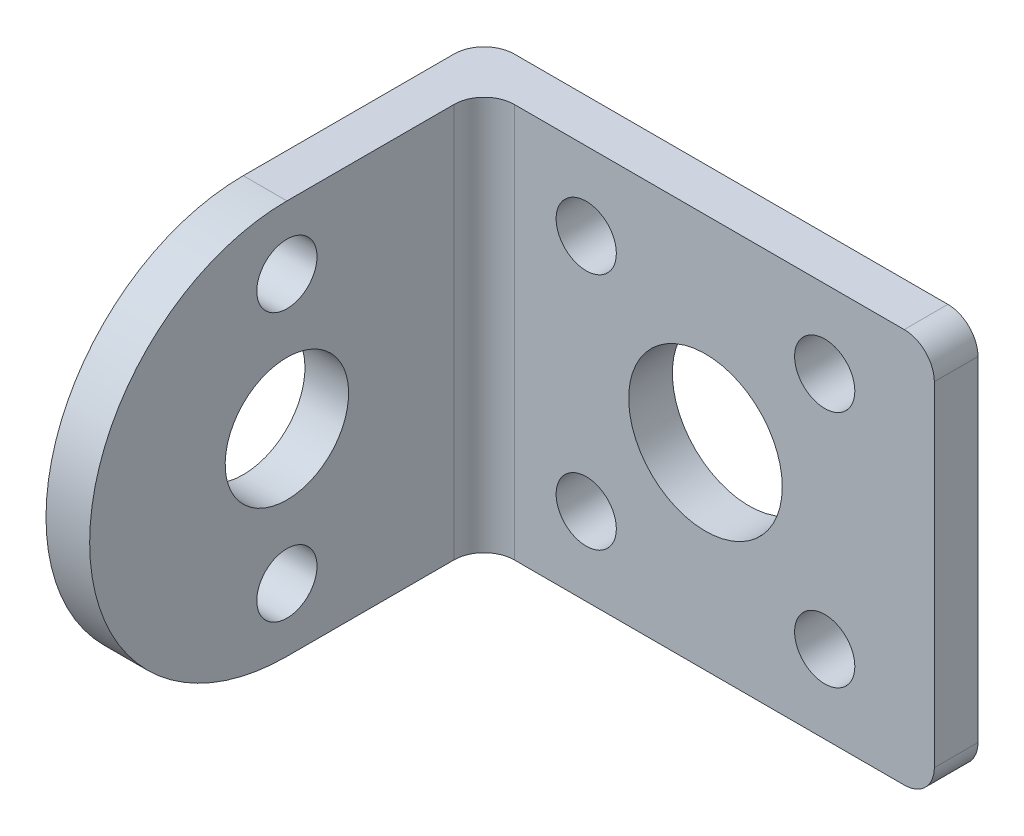
ISO-10303-21;
HEADER;
FILE_DESCRIPTION(('STEP AP214'),'2;1');
FILE_NAME('part.step','',(''),(''),'','','');
FILE_SCHEMA(('AUTOMOTIVE_DESIGN { 1 0 10303 214 1 1 1 1 }'));
ENDSEC;
DATA;
#1=APPLICATION_CONTEXT('core data for automotive mechanical design processes');
#2=APPLICATION_PROTOCOL_DEFINITION('international standard','automotive_design',2000,#1);
#3=PRODUCT_CONTEXT('',#1,'mechanical');
#4=PRODUCT('Part','Part','',(#3));
#5=PRODUCT_RELATED_PRODUCT_CATEGORY('part','',(#4));
#6=PRODUCT_DEFINITION_FORMATION('','',#4);
#7=PRODUCT_DEFINITION_CONTEXT('part definition',#1,'design');
#8=PRODUCT_DEFINITION('design','',#6,#7);
#9=PRODUCT_DEFINITION_SHAPE('','',#8);
#10=(LENGTH_UNIT() NAMED_UNIT(*) SI_UNIT(.MILLI.,.METRE.));
#11=(NAMED_UNIT(*) PLANE_ANGLE_UNIT() SI_UNIT($,.RADIAN.));
#12=(NAMED_UNIT(*) SI_UNIT($,.STERADIAN.) SOLID_ANGLE_UNIT());
#13=UNCERTAINTY_MEASURE_WITH_UNIT(LENGTH_MEASURE(1.E-05),#10,'distance_accuracy_value','');
#14=(GEOMETRIC_REPRESENTATION_CONTEXT(3) GLOBAL_UNCERTAINTY_ASSIGNED_CONTEXT((#13)) GLOBAL_UNIT_ASSIGNED_CONTEXT((#10,
#11,#12)) REPRESENTATION_CONTEXT('',''));
#15=CARTESIAN_POINT('',(0.,0.,0.));
#16=DIRECTION('',(0.,0.,1.));
#17=DIRECTION('',(1.,0.,0.));
#18=AXIS2_PLACEMENT_3D('',#15,#16,#17);
#19=CARTESIAN_POINT('',(0.,0.,1.45));
#20=DIRECTION('',(1.,0.,0.));
#21=DIRECTION('',(0.,1.,0.));
#22=AXIS2_PLACEMENT_3D('',#19,#20,#21);
#23=PLANE('',#22);
#24=CARTESIAN_POINT('',(0.,-8.9,16.));
#25=DIRECTION('',(-1.,0.,0.));
#26=DIRECTION('',(0.,1.,0.));
#27=AXIS2_PLACEMENT_3D('',#24,#25,#26);
#28=CIRCLE('',#27,2.);
#29=CARTESIAN_POINT('',(0.,-10.9,16.));
#30=VERTEX_POINT('',#29);
#31=EDGE_CURVE('E348',#30,#30,#28,.T.);
#32=ORIENTED_EDGE('',*,*,#31,.F.);
#33=EDGE_LOOP('',(#32));
#34=FACE_BOUND('',#33,.T.);
#35=CARTESIAN_POINT('',(0.,8.9,16.));
#36=DIRECTION('',(-1.,0.,0.));
#37=DIRECTION('',(0.,1.,0.));
#38=AXIS2_PLACEMENT_3D('',#35,#36,#37);
#39=CIRCLE('',#38,2.);
#40=CARTESIAN_POINT('',(0.,6.9,16.));
#41=VERTEX_POINT('',#40);
#42=EDGE_CURVE('E260',#41,#41,#39,.T.);
#43=ORIENTED_EDGE('',*,*,#42,.F.);
#44=EDGE_LOOP('',(#43));
#45=FACE_BOUND('',#44,.T.);
#46=CARTESIAN_POINT('',(0.,0.,16.));
#47=DIRECTION('',(-1.,0.,0.));
#48=DIRECTION('',(0.,1.,0.));
#49=AXIS2_PLACEMENT_3D('',#46,#47,#48);
#50=CIRCLE('',#49,4.1);
#51=CARTESIAN_POINT('',(0.,-4.1,16.));
#52=VERTEX_POINT('',#51);
#53=EDGE_CURVE('E201',#52,#52,#50,.T.);
#54=ORIENTED_EDGE('',*,*,#53,.F.);
#55=EDGE_LOOP('',(#54));
#56=FACE_BOUND('',#55,.T.);
#57=DIRECTION('',(0.,1.,0.));
#58=VECTOR('',#57,1.);
#59=CARTESIAN_POINT('',(0.,-6.55,2.));
#60=LINE('',#59,#58);
#61=CARTESIAN_POINT('',(0.,-13.1,2.));
#62=VERTEX_POINT('',#61);
#63=CARTESIAN_POINT('',(0.,13.1,2.));
#64=VERTEX_POINT('',#63);
#65=EDGE_CURVE('E297',#62,#64,#60,.T.);
#66=ORIENTED_EDGE('',*,*,#65,.F.);
#67=DIRECTION('',(0.,0.,1.));
#68=VECTOR('',#67,1.);
#69=CARTESIAN_POINT('',(0.,-13.1,2.9));
#70=LINE('',#69,#68);
#71=CARTESIAN_POINT('',(0.,-13.1,16.));
#72=VERTEX_POINT('',#71);
#73=EDGE_CURVE('E11',#62,#72,#70,.T.);
#74=ORIENTED_EDGE('',*,*,#73,.T.);
#75=CARTESIAN_POINT('',(0.,0.,16.));
#76=DIRECTION('',(1.,0.,0.));
#77=DIRECTION('',(0.,1.,0.));
#78=AXIS2_PLACEMENT_3D('',#75,#76,#77);
#79=CIRCLE('',#78,13.1);
#80=CARTESIAN_POINT('',(0.,13.1,16.));
#81=VERTEX_POINT('',#80);
#82=EDGE_CURVE('E218',#81,#72,#79,.T.);
#83=ORIENTED_EDGE('',*,*,#82,.F.);
#84=DIRECTION('',(0.,0.,-1.));
#85=VECTOR('',#84,1.);
#86=CARTESIAN_POINT('',(0.,13.1,2.9));
#87=LINE('',#86,#85);
#88=EDGE_CURVE('E296',#81,#64,#87,.T.);
#89=ORIENTED_EDGE('',*,*,#88,.T.);
#90=EDGE_LOOP('',(#66,#74,#83,#89));
#91=FACE_BOUND('',#90,.T.);
#92=ADVANCED_FACE('F16',(#34,#45,#56,#91),#23,.F.);
#93=CARTESIAN_POINT('',(0.,13.1,2.9));
#94=DIRECTION('',(0.,0.,1.));
#95=DIRECTION('',(1.,0.,0.));
#96=AXIS2_PLACEMENT_3D('',#93,#94,#95);
#97=PLANE('',#96);
#98=CARTESIAN_POINT('',(9.68040405071067,7.91959594928933,2.9));
#99=DIRECTION('',(0.,0.,-1.));
#100=DIRECTION('',(-1.,0.,0.));
#101=AXIS2_PLACEMENT_3D('',#98,#99,#100);
#102=CIRCLE('',#101,2.);
#103=CARTESIAN_POINT('',(11.6804040507107,7.91959594928933,2.9));
#104=VERTEX_POINT('',#103);
#105=EDGE_CURVE('E199',#104,#104,#102,.T.);
#106=ORIENTED_EDGE('',*,*,#105,.T.);
#107=EDGE_LOOP('',(#106));
#108=FACE_BOUND('',#107,.T.);
#109=CARTESIAN_POINT('',(17.6,0.,2.9));
#110=DIRECTION('',(0.,0.,-1.));
#111=DIRECTION('',(-1.,0.,0.));
#112=AXIS2_PLACEMENT_3D('',#109,#110,#111);
#113=CIRCLE('',#112,5.1);
#114=CARTESIAN_POINT('',(22.7,0.,2.9));
#115=VERTEX_POINT('',#114);
#116=EDGE_CURVE('E195',#115,#115,#113,.T.);
#117=ORIENTED_EDGE('',*,*,#116,.T.);
#118=EDGE_LOOP('',(#117));
#119=FACE_BOUND('',#118,.T.);
#120=CARTESIAN_POINT('',(25.5195959492893,-7.91959594928934,2.9));
#121=DIRECTION('',(0.,0.,-1.));
#122=DIRECTION('',(-1.,0.,0.));
#123=AXIS2_PLACEMENT_3D('',#120,#121,#122);
#124=CIRCLE('',#123,2.);
#125=CARTESIAN_POINT('',(27.5195959492893,-7.91959594928934,2.9));
#126=VERTEX_POINT('',#125);
#127=EDGE_CURVE('E179',#126,#126,#124,.T.);
#128=ORIENTED_EDGE('',*,*,#127,.T.);
#129=EDGE_LOOP('',(#128));
#130=FACE_BOUND('',#129,.T.);
#131=CARTESIAN_POINT('',(9.68040405071067,-7.91959594928934,2.9));
#132=DIRECTION('',(0.,0.,-1.));
#133=DIRECTION('',(-1.,0.,0.));
#134=AXIS2_PLACEMENT_3D('',#131,#132,#133);
#135=CIRCLE('',#134,2.);
#136=CARTESIAN_POINT('',(11.6804040507107,-7.91959594928934,2.9));
#137=VERTEX_POINT('',#136);
#138=EDGE_CURVE('E183',#137,#137,#135,.T.);
#139=ORIENTED_EDGE('',*,*,#138,.T.);
#140=EDGE_LOOP('',(#139));
#141=FACE_BOUND('',#140,.T.);
#142=CARTESIAN_POINT('',(25.5195959492893,7.91959594928933,2.9));
#143=DIRECTION('',(0.,0.,-1.));
#144=DIRECTION('',(-1.,0.,0.));
#145=AXIS2_PLACEMENT_3D('',#142,#143,#144);
#146=CIRCLE('',#145,2.);
#147=CARTESIAN_POINT('',(27.5195959492893,7.91959594928933,2.9));
#148=VERTEX_POINT('',#147);
#149=EDGE_CURVE('E322',#148,#148,#146,.T.);
#150=ORIENTED_EDGE('',*,*,#149,.T.);
#151=EDGE_LOOP('',(#150));
#152=FACE_BOUND('',#151,.T.);
#153=CARTESIAN_POINT('',(30.8,11.1,2.9));
#154=DIRECTION('',(0.,0.,-1.));
#155=DIRECTION('',(0.707106781186548,0.707106781186547,0.));
#156=AXIS2_PLACEMENT_3D('',#153,#154,#155);
#157=CIRCLE('',#156,2.);
#158=CARTESIAN_POINT('',(30.8,13.1,2.9));
#159=VERTEX_POINT('',#158);
#160=CARTESIAN_POINT('',(32.8,11.1,2.9));
#161=VERTEX_POINT('',#160);
#162=EDGE_CURVE('E289',#159,#161,#157,.T.);
#163=ORIENTED_EDGE('',*,*,#162,.F.);
#164=DIRECTION('',(1.,0.,0.));
#165=VECTOR('',#164,1.);
#166=CARTESIAN_POINT('',(0.,13.1,2.9));
#167=LINE('',#166,#165);
#168=CARTESIAN_POINT('',(4.9,13.1,2.9));
#169=VERTEX_POINT('',#168);
#170=EDGE_CURVE('E223',#169,#159,#167,.T.);
#171=ORIENTED_EDGE('',*,*,#170,.F.);
#172=DIRECTION('',(0.,1.,0.));
#173=VECTOR('',#172,1.);
#174=CARTESIAN_POINT('',(4.9,6.55,2.9));
#175=LINE('',#174,#173);
#176=CARTESIAN_POINT('',(4.9,-13.1,2.9));
#177=VERTEX_POINT('',#176);
#178=EDGE_CURVE('E234',#177,#169,#175,.T.);
#179=ORIENTED_EDGE('',*,*,#178,.F.);
#180=DIRECTION('',(1.,0.,0.));
#181=VECTOR('',#180,1.);
#182=CARTESIAN_POINT('',(0.,-13.1,2.9));
#183=LINE('',#182,#181);
#184=CARTESIAN_POINT('',(30.8,-13.1,2.9));
#185=VERTEX_POINT('',#184);
#186=EDGE_CURVE('E27',#177,#185,#183,.T.);
#187=ORIENTED_EDGE('',*,*,#186,.T.);
#188=CARTESIAN_POINT('',(30.8,-11.1,2.9));
#189=DIRECTION('',(0.,0.,-1.));
#190=DIRECTION('',(0.707106781186548,-0.707106781186547,0.));
#191=AXIS2_PLACEMENT_3D('',#188,#189,#190);
#192=CIRCLE('',#191,2.);
#193=CARTESIAN_POINT('',(32.8,-11.1,2.9));
#194=VERTEX_POINT('',#193);
#195=EDGE_CURVE('E210',#194,#185,#192,.T.);
#196=ORIENTED_EDGE('',*,*,#195,.F.);
#197=DIRECTION('',(0.,-1.,0.));
#198=VECTOR('',#197,1.);
#199=CARTESIAN_POINT('',(32.8,-13.1,2.9));
#200=LINE('',#199,#198);
#201=EDGE_CURVE('E253',#161,#194,#200,.T.);
#202=ORIENTED_EDGE('',*,*,#201,.F.);
#203=EDGE_LOOP('',(#163,#171,#179,#187,#196,#202));
#204=FACE_BOUND('',#203,.T.);
#205=ADVANCED_FACE('F186',(#108,#119,#130,#141,#152,#204),#97,.T.);
#206=CARTESIAN_POINT('',(0.,-13.1,2.9));
#207=DIRECTION('',(0.,-1.,0.));
#208=DIRECTION('',(0.,0.,-1.));
#209=AXIS2_PLACEMENT_3D('',#206,#207,#208);
#210=PLANE('',#209);
#211=DIRECTION('',(0.,0.,-1.));
#212=VECTOR('',#211,1.);
#213=CARTESIAN_POINT('',(30.8,-13.1,2.175));
#214=LINE('',#213,#212);
#215=CARTESIAN_POINT('',(30.8,-13.1,0.));
#216=VERTEX_POINT('',#215);
#217=EDGE_CURVE('E206',#185,#216,#214,.T.);
#218=ORIENTED_EDGE('',*,*,#217,.F.);
#219=ORIENTED_EDGE('',*,*,#186,.F.);
#220=CARTESIAN_POINT('',(4.9,-13.1,4.9));
#221=DIRECTION('',(0.,-1.,0.));
#222=DIRECTION('',(-0.707106781186548,0.,-0.707106781186548));
#223=AXIS2_PLACEMENT_3D('',#220,#221,#222);
#224=CIRCLE('',#223,2.);
#225=CARTESIAN_POINT('',(2.9,-13.1,4.9));
#226=VERTEX_POINT('',#225);
#227=EDGE_CURVE('E222',#226,#177,#224,.T.);
#228=ORIENTED_EDGE('',*,*,#227,.F.);
#229=DIRECTION('',(0.,0.,-1.));
#230=VECTOR('',#229,1.);
#231=CARTESIAN_POINT('',(2.9,-13.1,2.9));
#232=LINE('',#231,#230);
#233=CARTESIAN_POINT('',(2.9,-13.1,16.));
#234=VERTEX_POINT('',#233);
#235=EDGE_CURVE('E314',#234,#226,#232,.T.);
#236=ORIENTED_EDGE('',*,*,#235,.F.);
#237=DIRECTION('',(1.,0.,0.));
#238=VECTOR('',#237,1.);
#239=CARTESIAN_POINT('',(0.,-13.1,16.));
#240=LINE('',#239,#238);
#241=EDGE_CURVE('E215',#72,#234,#240,.T.);
#242=ORIENTED_EDGE('',*,*,#241,.F.);
#243=ORIENTED_EDGE('',*,*,#73,.F.);
#244=CARTESIAN_POINT('',(2.,-13.1,2.));
#245=DIRECTION('',(0.,1.,0.));
#246=DIRECTION('',(-0.707106781186548,0.,-0.707106781186548));
#247=AXIS2_PLACEMENT_3D('',#244,#245,#246);
#248=CIRCLE('',#247,2.);
#249=CARTESIAN_POINT('',(2.,-13.1,0.));
#250=VERTEX_POINT('',#249);
#251=EDGE_CURVE('E209',#250,#62,#248,.T.);
#252=ORIENTED_EDGE('',*,*,#251,.F.);
#253=DIRECTION('',(1.,0.,0.));
#254=VECTOR('',#253,1.);
#255=CARTESIAN_POINT('',(0.,-13.1,0.));
#256=LINE('',#255,#254);
#257=EDGE_CURVE('E241',#250,#216,#256,.T.);
#258=ORIENTED_EDGE('',*,*,#257,.T.);
#259=EDGE_LOOP('',(#218,#219,#228,#236,#242,#243,#252,#258));
#260=FACE_BOUND('',#259,.T.);
#261=ADVANCED_FACE('F239',(#260),#210,.T.);
#262=CARTESIAN_POINT('',(0.,0.,16.));
#263=DIRECTION('',(1.,0.,0.));
#264=DIRECTION('',(0.,1.,0.));
#265=AXIS2_PLACEMENT_3D('',#262,#263,#264);
#266=CYLINDRICAL_SURFACE('',#265,13.1);
#267=ORIENTED_EDGE('',*,*,#82,.T.);
#268=ORIENTED_EDGE('',*,*,#241,.T.);
#269=CARTESIAN_POINT('',(2.9,0.,16.));
#270=DIRECTION('',(1.,0.,0.));
#271=DIRECTION('',(0.,1.,0.));
#272=AXIS2_PLACEMENT_3D('',#269,#270,#271);
#273=CIRCLE('',#272,13.1);
#274=CARTESIAN_POINT('',(2.9,13.1,16.));
#275=VERTEX_POINT('',#274);
#276=EDGE_CURVE('E331',#275,#234,#273,.T.);
#277=ORIENTED_EDGE('',*,*,#276,.F.);
#278=DIRECTION('',(1.,0.,0.));
#279=VECTOR('',#278,1.);
#280=CARTESIAN_POINT('',(0.,13.1,16.));
#281=LINE('',#280,#279);
#282=EDGE_CURVE('E288',#81,#275,#281,.T.);
#283=ORIENTED_EDGE('',*,*,#282,.F.);
#284=EDGE_LOOP('',(#267,#268,#277,#283));
#285=FACE_BOUND('',#284,.T.);
#286=ADVANCED_FACE('F671',(#285),#266,.T.);
#287=CARTESIAN_POINT('',(0.,-8.9,16.));
#288=DIRECTION('',(1.,0.,0.));
#289=DIRECTION('',(0.,1.,0.));
#290=AXIS2_PLACEMENT_3D('',#287,#288,#289);
#291=CYLINDRICAL_SURFACE('',#290,2.);
#292=CARTESIAN_POINT('',(2.9,-8.9,16.));
#293=DIRECTION('',(-1.,0.,0.));
#294=DIRECTION('',(0.,1.,0.));
#295=AXIS2_PLACEMENT_3D('',#292,#293,#294);
#296=CIRCLE('',#295,2.);
#297=CARTESIAN_POINT('',(2.9,-10.9,16.));
#298=VERTEX_POINT('',#297);
#299=EDGE_CURVE('E306',#298,#298,#296,.T.);
#300=ORIENTED_EDGE('',*,*,#299,.F.);
#301=DIRECTION('',(-1.,0.,0.));
#302=VECTOR('',#301,1.);
#303=CARTESIAN_POINT('',(0.,-10.9,16.));
#304=LINE('',#303,#302);
#305=EDGE_CURVE('E351',#298,#30,#304,.T.);
#306=ORIENTED_EDGE('',*,*,#305,.T.);
#307=ORIENTED_EDGE('',*,*,#31,.T.);
#308=ORIENTED_EDGE('',*,*,#305,.F.);
#309=EDGE_LOOP('',(#300,#306,#307,#308));
#310=FACE_BOUND('',#309,.T.);
#311=ADVANCED_FACE('F617',(#310),#291,.F.);
#312=CARTESIAN_POINT('',(0.,8.9,16.));
#313=DIRECTION('',(1.,0.,0.));
#314=DIRECTION('',(0.,1.,0.));
#315=AXIS2_PLACEMENT_3D('',#312,#313,#314);
#316=CYLINDRICAL_SURFACE('',#315,2.);
#317=CARTESIAN_POINT('',(2.9,8.9,16.));
#318=DIRECTION('',(-1.,0.,0.));
#319=DIRECTION('',(0.,1.,0.));
#320=AXIS2_PLACEMENT_3D('',#317,#318,#319);
#321=CIRCLE('',#320,2.);
#322=CARTESIAN_POINT('',(2.9,6.9,16.));
#323=VERTEX_POINT('',#322);
#324=EDGE_CURVE('E302',#323,#323,#321,.T.);
#325=ORIENTED_EDGE('',*,*,#324,.F.);
#326=DIRECTION('',(-1.,0.,0.));
#327=VECTOR('',#326,1.);
#328=CARTESIAN_POINT('',(0.,6.9,16.));
#329=LINE('',#328,#327);
#330=EDGE_CURVE('E204',#323,#41,#329,.T.);
#331=ORIENTED_EDGE('',*,*,#330,.T.);
#332=ORIENTED_EDGE('',*,*,#42,.T.);
#333=ORIENTED_EDGE('',*,*,#330,.F.);
#334=EDGE_LOOP('',(#325,#331,#332,#333));
#335=FACE_BOUND('',#334,.T.);
#336=ADVANCED_FACE('F569',(#335),#316,.F.);
#337=CARTESIAN_POINT('',(0.,0.,16.));
#338=DIRECTION('',(1.,0.,0.));
#339=DIRECTION('',(0.,1.,0.));
#340=AXIS2_PLACEMENT_3D('',#337,#338,#339);
#341=CYLINDRICAL_SURFACE('',#340,4.1);
#342=CARTESIAN_POINT('',(2.9,0.,16.));
#343=DIRECTION('',(-1.,0.,0.));
#344=DIRECTION('',(0.,1.,0.));
#345=AXIS2_PLACEMENT_3D('',#342,#343,#344);
#346=CIRCLE('',#345,4.1);
#347=CARTESIAN_POINT('',(2.9,-4.1,16.));
#348=VERTEX_POINT('',#347);
#349=EDGE_CURVE('E307',#348,#348,#346,.T.);
#350=ORIENTED_EDGE('',*,*,#349,.F.);
#351=DIRECTION('',(-1.,0.,0.));
#352=VECTOR('',#351,1.);
#353=CARTESIAN_POINT('',(0.,-4.1,16.));
#354=LINE('',#353,#352);
#355=EDGE_CURVE('E205',#348,#52,#354,.T.);
#356=ORIENTED_EDGE('',*,*,#355,.T.);
#357=ORIENTED_EDGE('',*,*,#53,.T.);
#358=ORIENTED_EDGE('',*,*,#355,.F.);
#359=EDGE_LOOP('',(#350,#356,#357,#358));
#360=FACE_BOUND('',#359,.T.);
#361=ADVANCED_FACE('F564',(#360),#341,.F.);
#362=CARTESIAN_POINT('',(25.5195959492893,7.91959594928933,2.9));
#363=DIRECTION('',(0.,0.,-1.));
#364=DIRECTION('',(-1.,0.,0.));
#365=AXIS2_PLACEMENT_3D('',#362,#363,#364);
#366=CYLINDRICAL_SURFACE('',#365,2.);
#367=ORIENTED_EDGE('',*,*,#149,.F.);
#368=DIRECTION('',(0.,0.,-1.));
#369=VECTOR('',#368,1.);
#370=CARTESIAN_POINT('',(27.5195959492893,7.91959594928933,2.9));
#371=LINE('',#370,#369);
#372=CARTESIAN_POINT('',(27.5195959492893,7.91959594928933,0.));
#373=VERTEX_POINT('',#372);
#374=EDGE_CURVE('E276',#148,#373,#371,.T.);
#375=ORIENTED_EDGE('',*,*,#374,.T.);
#376=CARTESIAN_POINT('',(25.5195959492893,7.91959594928933,0.));
#377=DIRECTION('',(0.,0.,1.));
#378=DIRECTION('',(-1.,0.,0.));
#379=AXIS2_PLACEMENT_3D('',#376,#377,#378);
#380=CIRCLE('',#379,2.);
#381=EDGE_CURVE('E315',#373,#373,#380,.T.);
#382=ORIENTED_EDGE('',*,*,#381,.F.);
#383=ORIENTED_EDGE('',*,*,#374,.F.);
#384=EDGE_LOOP('',(#367,#375,#382,#383));
#385=FACE_BOUND('',#384,.T.);
#386=ADVANCED_FACE('F568',(#385),#366,.F.);
#387=CARTESIAN_POINT('',(9.68040405071067,-7.91959594928934,2.9));
#388=DIRECTION('',(0.,0.,-1.));
#389=DIRECTION('',(-1.,0.,0.));
#390=AXIS2_PLACEMENT_3D('',#387,#388,#389);
#391=CYLINDRICAL_SURFACE('',#390,2.);
#392=ORIENTED_EDGE('',*,*,#138,.F.);
#393=DIRECTION('',(0.,0.,-1.));
#394=VECTOR('',#393,1.);
#395=CARTESIAN_POINT('',(11.6804040507107,-7.91959594928934,2.9));
#396=LINE('',#395,#394);
#397=CARTESIAN_POINT('',(11.6804040507107,-7.91959594928934,0.));
#398=VERTEX_POINT('',#397);
#399=EDGE_CURVE('E214',#137,#398,#396,.T.);
#400=ORIENTED_EDGE('',*,*,#399,.T.);
#401=CARTESIAN_POINT('',(9.68040405071067,-7.91959594928934,0.));
#402=DIRECTION('',(0.,0.,1.));
#403=DIRECTION('',(-1.,0.,0.));
#404=AXIS2_PLACEMENT_3D('',#401,#402,#403);
#405=CIRCLE('',#404,2.);
#406=EDGE_CURVE('E267',#398,#398,#405,.T.);
#407=ORIENTED_EDGE('',*,*,#406,.F.);
#408=ORIENTED_EDGE('',*,*,#399,.F.);
#409=EDGE_LOOP('',(#392,#400,#407,#408));
#410=FACE_BOUND('',#409,.T.);
#411=ADVANCED_FACE('F600',(#410),#391,.F.);
#412=CARTESIAN_POINT('',(25.5195959492893,-7.91959594928934,2.9));
#413=DIRECTION('',(0.,0.,-1.));
#414=DIRECTION('',(-1.,0.,0.));
#415=AXIS2_PLACEMENT_3D('',#412,#413,#414);
#416=CYLINDRICAL_SURFACE('',#415,2.);
#417=ORIENTED_EDGE('',*,*,#127,.F.);
#418=DIRECTION('',(0.,0.,-1.));
#419=VECTOR('',#418,1.);
#420=CARTESIAN_POINT('',(27.5195959492893,-7.91959594928934,2.9));
#421=LINE('',#420,#419);
#422=CARTESIAN_POINT('',(27.5195959492893,-7.91959594928934,0.));
#423=VERTEX_POINT('',#422);
#424=EDGE_CURVE('E176',#126,#423,#421,.T.);
#425=ORIENTED_EDGE('',*,*,#424,.T.);
#426=CARTESIAN_POINT('',(25.5195959492893,-7.91959594928934,0.));
#427=DIRECTION('',(0.,0.,1.));
#428=DIRECTION('',(-1.,0.,0.));
#429=AXIS2_PLACEMENT_3D('',#426,#427,#428);
#430=CIRCLE('',#429,2.);
#431=EDGE_CURVE('E181',#423,#423,#430,.T.);
#432=ORIENTED_EDGE('',*,*,#431,.F.);
#433=ORIENTED_EDGE('',*,*,#424,.F.);
#434=EDGE_LOOP('',(#417,#425,#432,#433));
#435=FACE_BOUND('',#434,.T.);
#436=ADVANCED_FACE('F178',(#435),#416,.F.);
#437=CARTESIAN_POINT('',(17.6,0.,2.9));
#438=DIRECTION('',(0.,0.,-1.));
#439=DIRECTION('',(-1.,0.,0.));
#440=AXIS2_PLACEMENT_3D('',#437,#438,#439);
#441=CYLINDRICAL_SURFACE('',#440,5.1);
#442=ORIENTED_EDGE('',*,*,#116,.F.);
#443=DIRECTION('',(0.,0.,-1.));
#444=VECTOR('',#443,1.);
#445=CARTESIAN_POINT('',(22.7,0.,2.9));
#446=LINE('',#445,#444);
#447=CARTESIAN_POINT('',(22.7,0.,0.));
#448=VERTEX_POINT('',#447);
#449=EDGE_CURVE('E189',#115,#448,#446,.T.);
#450=ORIENTED_EDGE('',*,*,#449,.T.);
#451=CARTESIAN_POINT('',(17.6,0.,0.));
#452=DIRECTION('',(0.,0.,1.));
#453=DIRECTION('',(-1.,0.,0.));
#454=AXIS2_PLACEMENT_3D('',#451,#452,#453);
#455=CIRCLE('',#454,5.1);
#456=EDGE_CURVE('E268',#448,#448,#455,.T.);
#457=ORIENTED_EDGE('',*,*,#456,.F.);
#458=ORIENTED_EDGE('',*,*,#449,.F.);
#459=EDGE_LOOP('',(#442,#450,#457,#458));
#460=FACE_BOUND('',#459,.T.);
#461=ADVANCED_FACE('F609',(#460),#441,.F.);
#462=CARTESIAN_POINT('',(9.68040405071067,7.91959594928933,2.9));
#463=DIRECTION('',(0.,0.,-1.));
#464=DIRECTION('',(-1.,0.,0.));
#465=AXIS2_PLACEMENT_3D('',#462,#463,#464);
#466=CYLINDRICAL_SURFACE('',#465,2.);
#467=ORIENTED_EDGE('',*,*,#105,.F.);
#468=DIRECTION('',(0.,0.,-1.));
#469=VECTOR('',#468,1.);
#470=CARTESIAN_POINT('',(11.6804040507107,7.91959594928933,2.9));
#471=LINE('',#470,#469);
#472=CARTESIAN_POINT('',(11.6804040507107,7.91959594928933,0.));
#473=VERTEX_POINT('',#472);
#474=EDGE_CURVE('E264',#104,#473,#471,.T.);
#475=ORIENTED_EDGE('',*,*,#474,.T.);
#476=CARTESIAN_POINT('',(9.68040405071067,7.91959594928933,0.));
#477=DIRECTION('',(0.,0.,1.));
#478=DIRECTION('',(-1.,0.,0.));
#479=AXIS2_PLACEMENT_3D('',#476,#477,#478);
#480=CIRCLE('',#479,2.);
#481=EDGE_CURVE('E20',#473,#473,#480,.T.);
#482=ORIENTED_EDGE('',*,*,#481,.F.);
#483=ORIENTED_EDGE('',*,*,#474,.F.);
#484=EDGE_LOOP('',(#467,#475,#482,#483));
#485=FACE_BOUND('',#484,.T.);
#486=ADVANCED_FACE('F424',(#485),#466,.F.);
#487=CARTESIAN_POINT('',(2.9,0.,16.));
#488=DIRECTION('',(1.,0.,0.));
#489=DIRECTION('',(0.,1.,0.));
#490=AXIS2_PLACEMENT_3D('',#487,#488,#489);
#491=PLANE('',#490);
#492=ORIENTED_EDGE('',*,*,#299,.T.);
#493=EDGE_LOOP('',(#492));
#494=FACE_BOUND('',#493,.T.);
#495=ORIENTED_EDGE('',*,*,#324,.T.);
#496=EDGE_LOOP('',(#495));
#497=FACE_BOUND('',#496,.T.);
#498=ORIENTED_EDGE('',*,*,#349,.T.);
#499=EDGE_LOOP('',(#498));
#500=FACE_BOUND('',#499,.T.);
#501=DIRECTION('',(0.,-1.,0.));
#502=VECTOR('',#501,1.);
#503=CARTESIAN_POINT('',(2.9,6.55,4.9));
#504=LINE('',#503,#502);
#505=CARTESIAN_POINT('',(2.9,13.1,4.9));
#506=VERTEX_POINT('',#505);
#507=EDGE_CURVE('E219',#506,#226,#504,.T.);
#508=ORIENTED_EDGE('',*,*,#507,.F.);
#509=DIRECTION('',(0.,0.,1.));
#510=VECTOR('',#509,1.);
#511=CARTESIAN_POINT('',(2.9,13.1,2.9));
#512=LINE('',#511,#510);
#513=EDGE_CURVE('E283',#506,#275,#512,.T.);
#514=ORIENTED_EDGE('',*,*,#513,.T.);
#515=ORIENTED_EDGE('',*,*,#276,.T.);
#516=ORIENTED_EDGE('',*,*,#235,.T.);
#517=EDGE_LOOP('',(#508,#514,#515,#516));
#518=FACE_BOUND('',#517,.T.);
#519=ADVANCED_FACE('F18',(#494,#497,#500,#518),#491,.T.);
#520=CARTESIAN_POINT('',(4.9,6.55,4.9));
#521=DIRECTION('',(0.,-1.,0.));
#522=DIRECTION('',(-0.707106781186548,0.,-0.707106781186548));
#523=AXIS2_PLACEMENT_3D('',#520,#521,#522);
#524=CYLINDRICAL_SURFACE('',#523,2.);
#525=CARTESIAN_POINT('',(4.9,13.1,4.9));
#526=DIRECTION('',(0.,1.,0.));
#527=DIRECTION('',(-0.707106781186548,0.,-0.707106781186548));
#528=AXIS2_PLACEMENT_3D('',#525,#526,#527);
#529=CIRCLE('',#528,2.);
#530=EDGE_CURVE('E287',#169,#506,#529,.T.);
#531=ORIENTED_EDGE('',*,*,#530,.T.);
#532=ORIENTED_EDGE('',*,*,#507,.T.);
#533=ORIENTED_EDGE('',*,*,#227,.T.);
#534=ORIENTED_EDGE('',*,*,#178,.T.);
#535=EDGE_LOOP('',(#531,#532,#533,#534));
#536=FACE_BOUND('',#535,.T.);
#537=ADVANCED_FACE('F393',(#536),#524,.F.);
#538=CARTESIAN_POINT('',(0.,13.1,0.));
#539=DIRECTION('',(0.,1.,0.));
#540=DIRECTION('',(1.,0.,0.));
#541=AXIS2_PLACEMENT_3D('',#538,#539,#540);
#542=PLANE('',#541);
#543=DIRECTION('',(0.,0.,1.));
#544=VECTOR('',#543,1.);
#545=CARTESIAN_POINT('',(30.8,13.1,0.725));
#546=LINE('',#545,#544);
#547=CARTESIAN_POINT('',(30.8,13.1,0.));
#548=VERTEX_POINT('',#547);
#549=EDGE_CURVE('E281',#548,#159,#546,.T.);
#550=ORIENTED_EDGE('',*,*,#549,.F.);
#551=DIRECTION('',(1.,0.,0.));
#552=VECTOR('',#551,1.);
#553=CARTESIAN_POINT('',(0.,13.1,0.));
#554=LINE('',#553,#552);
#555=CARTESIAN_POINT('',(2.,13.1,0.));
#556=VERTEX_POINT('',#555);
#557=EDGE_CURVE('E359',#556,#548,#554,.T.);
#558=ORIENTED_EDGE('',*,*,#557,.F.);
#559=CARTESIAN_POINT('',(2.,13.1,2.));
#560=DIRECTION('',(0.,-1.,0.));
#561=DIRECTION('',(-0.707106781186548,0.,-0.707106781186548));
#562=AXIS2_PLACEMENT_3D('',#559,#560,#561);
#563=CIRCLE('',#562,2.);
#564=EDGE_CURVE('E293',#64,#556,#563,.T.);
#565=ORIENTED_EDGE('',*,*,#564,.F.);
#566=ORIENTED_EDGE('',*,*,#88,.F.);
#567=ORIENTED_EDGE('',*,*,#282,.T.);
#568=ORIENTED_EDGE('',*,*,#513,.F.);
#569=ORIENTED_EDGE('',*,*,#530,.F.);
#570=ORIENTED_EDGE('',*,*,#170,.T.);
#571=EDGE_LOOP('',(#550,#558,#565,#566,#567,#568,#569,#570));
#572=FACE_BOUND('',#571,.T.);
#573=ADVANCED_FACE('F391',(#572),#542,.T.);
#574=CARTESIAN_POINT('',(2.,-6.55,2.));
#575=DIRECTION('',(0.,-1.,0.));
#576=DIRECTION('',(-0.707106781186548,0.,-0.707106781186548));
#577=AXIS2_PLACEMENT_3D('',#574,#575,#576);
#578=CYLINDRICAL_SURFACE('',#577,2.);
#579=ORIENTED_EDGE('',*,*,#251,.T.);
#580=ORIENTED_EDGE('',*,*,#65,.T.);
#581=ORIENTED_EDGE('',*,*,#564,.T.);
#582=DIRECTION('',(0.,-1.,0.));
#583=VECTOR('',#582,1.);
#584=CARTESIAN_POINT('',(2.,-6.55,0.));
#585=LINE('',#584,#583);
#586=EDGE_CURVE('E321',#556,#250,#585,.T.);
#587=ORIENTED_EDGE('',*,*,#586,.T.);
#588=EDGE_LOOP('',(#579,#580,#581,#587));
#589=FACE_BOUND('',#588,.T.);
#590=ADVANCED_FACE('F640',(#589),#578,.T.);
#591=CARTESIAN_POINT('',(30.8,-11.1,2.175));
#592=DIRECTION('',(0.,0.,-1.));
#593=DIRECTION('',(0.707106781186548,-0.707106781186547,0.));
#594=AXIS2_PLACEMENT_3D('',#591,#592,#593);
#595=CYLINDRICAL_SURFACE('',#594,2.);
#596=CARTESIAN_POINT('',(30.8,-11.1,0.));
#597=DIRECTION('',(0.,0.,1.));
#598=DIRECTION('',(0.707106781186548,-0.707106781186547,0.));
#599=AXIS2_PLACEMENT_3D('',#596,#597,#598);
#600=CIRCLE('',#599,2.);
#601=CARTESIAN_POINT('',(32.8,-11.1,0.));
#602=VERTEX_POINT('',#601);
#603=EDGE_CURVE('E269',#216,#602,#600,.T.);
#604=ORIENTED_EDGE('',*,*,#603,.T.);
#605=DIRECTION('',(0.,0.,1.));
#606=VECTOR('',#605,1.);
#607=CARTESIAN_POINT('',(32.8,-11.1,2.175));
#608=LINE('',#607,#606);
#609=EDGE_CURVE('E246',#602,#194,#608,.T.);
#610=ORIENTED_EDGE('',*,*,#609,.T.);
#611=ORIENTED_EDGE('',*,*,#195,.T.);
#612=ORIENTED_EDGE('',*,*,#217,.T.);
#613=EDGE_LOOP('',(#604,#610,#611,#612));
#614=FACE_BOUND('',#613,.T.);
#615=ADVANCED_FACE('F245',(#614),#595,.T.);
#616=CARTESIAN_POINT('',(32.8,0.,1.45));
#617=DIRECTION('',(1.,0.,0.));
#618=DIRECTION('',(0.,1.,0.));
#619=AXIS2_PLACEMENT_3D('',#616,#617,#618);
#620=PLANE('',#619);
#621=DIRECTION('',(0.,0.,-1.));
#622=VECTOR('',#621,1.);
#623=CARTESIAN_POINT('',(32.8,11.1,0.725));
#624=LINE('',#623,#622);
#625=CARTESIAN_POINT('',(32.8,11.1,0.));
#626=VERTEX_POINT('',#625);
#627=EDGE_CURVE('E282',#161,#626,#624,.T.);
#628=ORIENTED_EDGE('',*,*,#627,.F.);
#629=ORIENTED_EDGE('',*,*,#201,.T.);
#630=ORIENTED_EDGE('',*,*,#609,.F.);
#631=DIRECTION('',(0.,1.,0.));
#632=VECTOR('',#631,1.);
#633=CARTESIAN_POINT('',(32.8,13.1,0.));
#634=LINE('',#633,#632);
#635=EDGE_CURVE('E272',#602,#626,#634,.T.);
#636=ORIENTED_EDGE('',*,*,#635,.T.);
#637=EDGE_LOOP('',(#628,#629,#630,#636));
#638=FACE_BOUND('',#637,.T.);
#639=ADVANCED_FACE('F380',(#638),#620,.T.);
#640=CARTESIAN_POINT('',(0.,-13.1,0.));
#641=DIRECTION('',(0.,0.,-1.));
#642=DIRECTION('',(0.,-1.,0.));
#643=AXIS2_PLACEMENT_3D('',#640,#641,#642);
#644=PLANE('',#643);
#645=ORIENTED_EDGE('',*,*,#381,.T.);
#646=EDGE_LOOP('',(#645));
#647=FACE_BOUND('',#646,.T.);
#648=ORIENTED_EDGE('',*,*,#406,.T.);
#649=EDGE_LOOP('',(#648));
#650=FACE_BOUND('',#649,.T.);
#651=ORIENTED_EDGE('',*,*,#431,.T.);
#652=EDGE_LOOP('',(#651));
#653=FACE_BOUND('',#652,.T.);
#654=ORIENTED_EDGE('',*,*,#456,.T.);
#655=EDGE_LOOP('',(#654));
#656=FACE_BOUND('',#655,.T.);
#657=ORIENTED_EDGE('',*,*,#481,.T.);
#658=EDGE_LOOP('',(#657));
#659=FACE_BOUND('',#658,.T.);
#660=CARTESIAN_POINT('',(30.8,11.1,0.));
#661=DIRECTION('',(0.,0.,1.));
#662=DIRECTION('',(0.707106781186548,0.707106781186547,0.));
#663=AXIS2_PLACEMENT_3D('',#660,#661,#662);
#664=CIRCLE('',#663,2.);
#665=EDGE_CURVE('E277',#626,#548,#664,.T.);
#666=ORIENTED_EDGE('',*,*,#665,.F.);
#667=ORIENTED_EDGE('',*,*,#635,.F.);
#668=ORIENTED_EDGE('',*,*,#603,.F.);
#669=ORIENTED_EDGE('',*,*,#257,.F.);
#670=ORIENTED_EDGE('',*,*,#586,.F.);
#671=ORIENTED_EDGE('',*,*,#557,.T.);
#672=EDGE_LOOP('',(#666,#667,#668,#669,#670,#671));
#673=FACE_BOUND('',#672,.T.);
#674=ADVANCED_FACE('F382',(#647,#650,#653,#656,#659,#673),#644,.T.);
#675=CARTESIAN_POINT('',(30.8,11.1,0.725));
#676=DIRECTION('',(0.,0.,1.));
#677=DIRECTION('',(0.707106781186548,0.707106781186547,0.));
#678=AXIS2_PLACEMENT_3D('',#675,#676,#677);
#679=CYLINDRICAL_SURFACE('',#678,2.);
#680=ORIENTED_EDGE('',*,*,#162,.T.);
#681=ORIENTED_EDGE('',*,*,#627,.T.);
#682=ORIENTED_EDGE('',*,*,#665,.T.);
#683=ORIENTED_EDGE('',*,*,#549,.T.);
#684=EDGE_LOOP('',(#680,#681,#682,#683));
#685=FACE_BOUND('',#684,.T.);
#686=ADVANCED_FACE('F387',(#685),#679,.T.);
#687=CLOSED_SHELL('',(#92,#205,#261,#286,#311,#336,#361,#386,#411,#436,#461,#486,#519,#537,#573,
#590,#615,#639,#674,#686));
#688=MANIFOLD_SOLID_BREP('B1',#687);
#689=ADVANCED_BREP_SHAPE_REPRESENTATION('',(#18,#688),#14);
#690=SHAPE_DEFINITION_REPRESENTATION(#9,#689);
ENDSEC;
END-ISO-10303-21;
